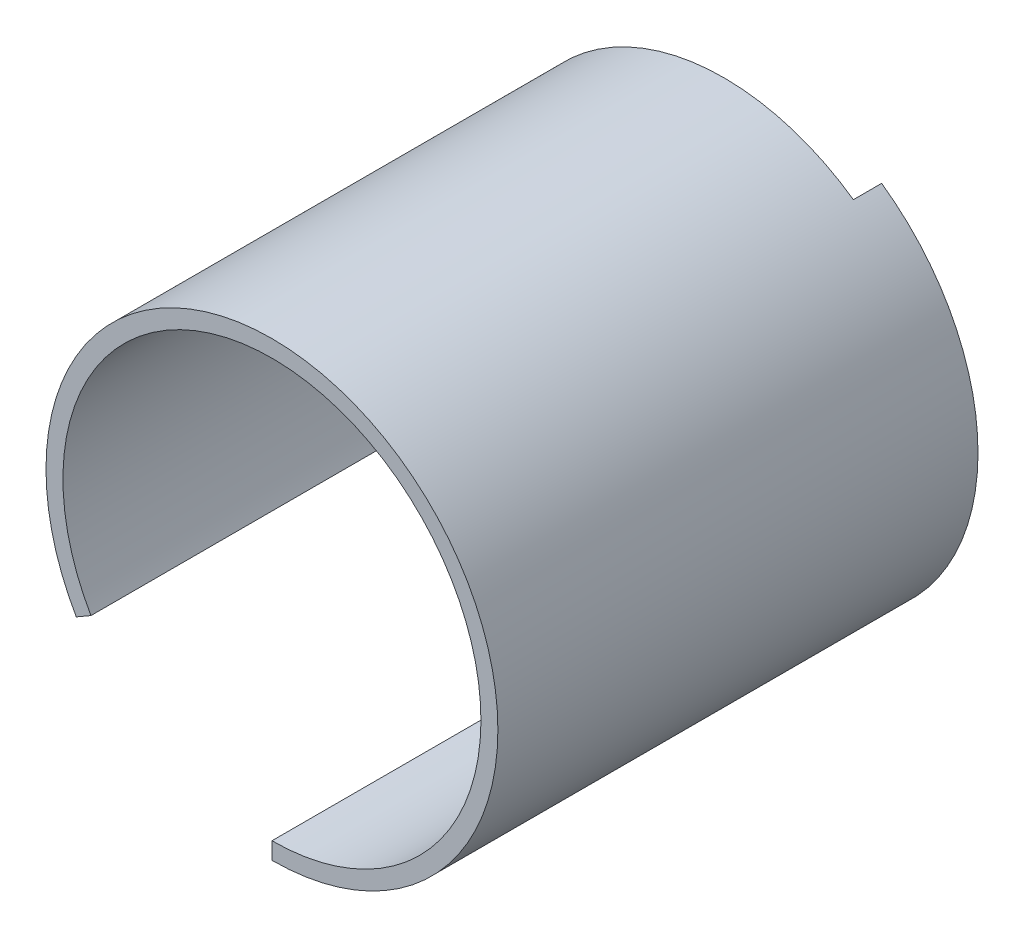
ISO-10303-21;
HEADER;
FILE_DESCRIPTION(('STEP AP214'),'2;1');
FILE_NAME('part.step','',(''),(''),'','','');
FILE_SCHEMA(('AUTOMOTIVE_DESIGN { 1 0 10303 214 1 1 1 1 }'));
ENDSEC;
DATA;
#1=APPLICATION_CONTEXT('core data for automotive mechanical design processes');
#2=APPLICATION_PROTOCOL_DEFINITION('international standard','automotive_design',2000,#1);
#3=PRODUCT_CONTEXT('',#1,'mechanical');
#4=PRODUCT('Part','Part','',(#3));
#5=PRODUCT_RELATED_PRODUCT_CATEGORY('part','',(#4));
#6=PRODUCT_DEFINITION_FORMATION('','',#4);
#7=PRODUCT_DEFINITION_CONTEXT('part definition',#1,'design');
#8=PRODUCT_DEFINITION('design','',#6,#7);
#9=PRODUCT_DEFINITION_SHAPE('','',#8);
#10=(LENGTH_UNIT() NAMED_UNIT(*) SI_UNIT(.MILLI.,.METRE.));
#11=(NAMED_UNIT(*) PLANE_ANGLE_UNIT() SI_UNIT($,.RADIAN.));
#12=(NAMED_UNIT(*) SI_UNIT($,.STERADIAN.) SOLID_ANGLE_UNIT());
#13=UNCERTAINTY_MEASURE_WITH_UNIT(LENGTH_MEASURE(1.E-05),#10,'distance_accuracy_value','');
#14=(GEOMETRIC_REPRESENTATION_CONTEXT(3) GLOBAL_UNCERTAINTY_ASSIGNED_CONTEXT((#13)) GLOBAL_UNIT_ASSIGNED_CONTEXT((#10,
#11,#12)) REPRESENTATION_CONTEXT('',''));
#15=CARTESIAN_POINT('',(0.,0.,0.));
#16=DIRECTION('',(0.,0.,1.));
#17=DIRECTION('',(1.,0.,0.));
#18=AXIS2_PLACEMENT_3D('',#15,#16,#17);
#19=CARTESIAN_POINT('',(0.,0.,80.));
#20=DIRECTION('',(0.,0.,-1.));
#21=DIRECTION('',(-1.,0.,0.));
#22=AXIS2_PLACEMENT_3D('',#19,#20,#21);
#23=CYLINDRICAL_SURFACE('',#22,37.);
#24=CARTESIAN_POINT('',(0.,0.,0.));
#25=DIRECTION('',(0.,0.,-1.));
#26=DIRECTION('',(-1.,0.,0.));
#27=AXIS2_PLACEMENT_3D('',#24,#25,#26);
#28=CIRCLE('',#27,37.);
#29=CARTESIAN_POINT('',(-32.0429399400243,-18.4999999999999,0.));
#30=VERTEX_POINT('',#29);
#31=CARTESIAN_POINT('',(21.2223281449887,30.3086256386927,0.));
#32=VERTEX_POINT('',#31);
#33=EDGE_CURVE('E149',#30,#32,#28,.T.);
#34=ORIENTED_EDGE('',*,*,#33,.T.);
#35=CARTESIAN_POINT('',(0.,-37.,0.));
#36=VERTEX_POINT('',#35);
#37=EDGE_CURVE('E142',#32,#36,#28,.T.);
#38=ORIENTED_EDGE('',*,*,#37,.T.);
#39=DIRECTION('',(0.,0.,-1.));
#40=VECTOR('',#39,1.);
#41=CARTESIAN_POINT('',(0.,-37.,80.));
#42=LINE('',#41,#40);
#43=CARTESIAN_POINT('',(0.,-37.,80.));
#44=VERTEX_POINT('',#43);
#45=EDGE_CURVE('E36',#44,#36,#42,.T.);
#46=ORIENTED_EDGE('',*,*,#45,.F.);
#47=CARTESIAN_POINT('',(0.,0.,80.));
#48=DIRECTION('',(0.,0.,-1.));
#49=DIRECTION('',(-1.,0.,0.));
#50=AXIS2_PLACEMENT_3D('',#47,#48,#49);
#51=CIRCLE('',#50,37.);
#52=CARTESIAN_POINT('',(-32.0429399400243,-18.4999999999999,80.));
#53=VERTEX_POINT('',#52);
#54=EDGE_CURVE('E143',#53,#44,#51,.T.);
#55=ORIENTED_EDGE('',*,*,#54,.F.);
#56=DIRECTION('',(0.,0.,-1.));
#57=VECTOR('',#56,1.);
#58=CARTESIAN_POINT('',(-32.0429399400243,-18.4999999999999,80.));
#59=LINE('',#58,#57);
#60=EDGE_CURVE('E148',#53,#30,#59,.T.);
#61=ORIENTED_EDGE('',*,*,#60,.T.);
#62=EDGE_LOOP('',(#34,#38,#46,#55,#61));
#63=FACE_BOUND('',#62,.T.);
#64=ADVANCED_FACE('F33',(#63),#23,.F.);
#65=CARTESIAN_POINT('',(0.,-37.,80.));
#66=DIRECTION('',(1.,0.,0.));
#67=DIRECTION('',(0.,0.,-1.));
#68=AXIS2_PLACEMENT_3D('',#65,#66,#67);
#69=PLANE('',#68);
#70=ORIENTED_EDGE('',*,*,#45,.T.);
#71=DIRECTION('',(0.,1.,0.));
#72=VECTOR('',#71,1.);
#73=CARTESIAN_POINT('',(0.,-30.,0.));
#74=LINE('',#73,#72);
#75=CARTESIAN_POINT('',(0.,-30.,0.));
#76=VERTEX_POINT('',#75);
#77=EDGE_CURVE('E134',#36,#76,#74,.T.);
#78=ORIENTED_EDGE('',*,*,#77,.T.);
#79=DIRECTION('',(0.,0.,1.));
#80=VECTOR('',#79,1.);
#81=CARTESIAN_POINT('',(0.,-30.,-5.));
#82=LINE('',#81,#80);
#83=CARTESIAN_POINT('',(0.,-30.,-5.));
#84=VERTEX_POINT('',#83);
#85=EDGE_CURVE('E118',#84,#76,#82,.T.);
#86=ORIENTED_EDGE('',*,*,#85,.F.);
#87=DIRECTION('',(0.,1.,0.));
#88=VECTOR('',#87,1.);
#89=CARTESIAN_POINT('',(0.,-30.,-5.));
#90=LINE('',#89,#88);
#91=CARTESIAN_POINT('',(0.,-40.,-5.));
#92=VERTEX_POINT('',#91);
#93=EDGE_CURVE('E115',#92,#84,#90,.T.);
#94=ORIENTED_EDGE('',*,*,#93,.F.);
#95=DIRECTION('',(0.,0.,-1.));
#96=VECTOR('',#95,1.);
#97=CARTESIAN_POINT('',(0.,-40.,80.));
#98=LINE('',#97,#96);
#99=CARTESIAN_POINT('',(0.,-40.,80.));
#100=VERTEX_POINT('',#99);
#101=EDGE_CURVE('E105',#100,#92,#98,.T.);
#102=ORIENTED_EDGE('',*,*,#101,.F.);
#103=DIRECTION('',(0.,-1.,0.));
#104=VECTOR('',#103,1.);
#105=CARTESIAN_POINT('',(0.,-37.,80.));
#106=LINE('',#105,#104);
#107=EDGE_CURVE('E82',#44,#100,#106,.T.);
#108=ORIENTED_EDGE('',*,*,#107,.F.);
#109=EDGE_LOOP('',(#70,#78,#86,#94,#102,#108));
#110=FACE_BOUND('',#109,.T.);
#111=ADVANCED_FACE('F116',(#110),#69,.F.);
#112=CARTESIAN_POINT('',(0.,0.,80.));
#113=DIRECTION('',(0.,0.,-1.));
#114=DIRECTION('',(-1.,0.,0.));
#115=AXIS2_PLACEMENT_3D('',#112,#113,#114);
#116=CYLINDRICAL_SURFACE('',#115,40.);
#117=ORIENTED_EDGE('',*,*,#101,.T.);
#118=CARTESIAN_POINT('',(0.,0.,-5.));
#119=DIRECTION('',(0.,0.,-1.));
#120=DIRECTION('',(-1.,0.,0.));
#121=AXIS2_PLACEMENT_3D('',#118,#119,#120);
#122=CIRCLE('',#121,40.);
#123=CARTESIAN_POINT('',(22.9430574540419,32.7660817715596,-5.));
#124=VERTEX_POINT('',#123);
#125=EDGE_CURVE('E110',#124,#92,#122,.T.);
#126=ORIENTED_EDGE('',*,*,#125,.F.);
#127=DIRECTION('',(0.,0.,1.));
#128=VECTOR('',#127,1.);
#129=CARTESIAN_POINT('',(22.9430574540419,32.7660817715596,-5.));
#130=LINE('',#129,#128);
#131=CARTESIAN_POINT('',(22.9430574540419,32.7660817715596,0.));
#132=VERTEX_POINT('',#131);
#133=EDGE_CURVE('E133',#124,#132,#130,.T.);
#134=ORIENTED_EDGE('',*,*,#133,.T.);
#135=CARTESIAN_POINT('',(0.,0.,0.));
#136=DIRECTION('',(0.,0.,1.));
#137=DIRECTION('',(-1.,0.,0.));
#138=AXIS2_PLACEMENT_3D('',#135,#136,#137);
#139=CIRCLE('',#138,40.);
#140=CARTESIAN_POINT('',(-34.6410161513776,-19.9999999999999,0.));
#141=VERTEX_POINT('',#140);
#142=EDGE_CURVE('E151',#132,#141,#139,.T.);
#143=ORIENTED_EDGE('',*,*,#142,.T.);
#144=DIRECTION('',(0.,0.,-1.));
#145=VECTOR('',#144,1.);
#146=CARTESIAN_POINT('',(-34.6410161513776,-19.9999999999999,80.));
#147=LINE('',#146,#145);
#148=CARTESIAN_POINT('',(-34.6410161513776,-19.9999999999999,80.));
#149=VERTEX_POINT('',#148);
#150=EDGE_CURVE('E113',#149,#141,#147,.T.);
#151=ORIENTED_EDGE('',*,*,#150,.F.);
#152=CARTESIAN_POINT('',(0.,0.,80.));
#153=DIRECTION('',(0.,0.,1.));
#154=DIRECTION('',(-1.,0.,0.));
#155=AXIS2_PLACEMENT_3D('',#152,#153,#154);
#156=CIRCLE('',#155,40.);
#157=EDGE_CURVE('E112',#100,#149,#156,.T.);
#158=ORIENTED_EDGE('',*,*,#157,.F.);
#159=EDGE_LOOP('',(#117,#126,#134,#143,#151,#158));
#160=FACE_BOUND('',#159,.T.);
#161=ADVANCED_FACE('F107',(#160),#116,.T.);
#162=CARTESIAN_POINT('',(-34.6410161513776,-19.9999999999999,80.));
#163=DIRECTION('',(-0.499999999999999,0.866025403784439,0.));
#164=DIRECTION('',(-0.866025403784439,-0.499999999999999,0.));
#165=AXIS2_PLACEMENT_3D('',#162,#163,#164);
#166=PLANE('',#165);
#167=DIRECTION('',(0.866025403784439,0.499999999999999,0.));
#168=VECTOR('',#167,1.);
#169=CARTESIAN_POINT('',(-34.6410161513776,-19.9999999999999,0.));
#170=LINE('',#169,#168);
#171=EDGE_CURVE('E74',#141,#30,#170,.T.);
#172=ORIENTED_EDGE('',*,*,#171,.T.);
#173=ORIENTED_EDGE('',*,*,#60,.F.);
#174=DIRECTION('',(0.866025403784439,0.499999999999999,0.));
#175=VECTOR('',#174,1.);
#176=CARTESIAN_POINT('',(-34.6410161513776,-19.9999999999999,80.));
#177=LINE('',#176,#175);
#178=EDGE_CURVE('E56',#149,#53,#177,.T.);
#179=ORIENTED_EDGE('',*,*,#178,.F.);
#180=ORIENTED_EDGE('',*,*,#150,.T.);
#181=EDGE_LOOP('',(#172,#173,#179,#180));
#182=FACE_BOUND('',#181,.T.);
#183=ADVANCED_FACE('F155',(#182),#166,.F.);
#184=CARTESIAN_POINT('',(0.,0.,80.));
#185=DIRECTION('',(0.,0.,-1.));
#186=DIRECTION('',(-1.,0.,0.));
#187=AXIS2_PLACEMENT_3D('',#184,#185,#186);
#188=PLANE('',#187);
#189=ORIENTED_EDGE('',*,*,#54,.T.);
#190=ORIENTED_EDGE('',*,*,#107,.T.);
#191=ORIENTED_EDGE('',*,*,#157,.T.);
#192=ORIENTED_EDGE('',*,*,#178,.T.);
#193=EDGE_LOOP('',(#189,#190,#191,#192));
#194=FACE_BOUND('',#193,.T.);
#195=ADVANCED_FACE('F178',(#194),#188,.F.);
#196=CARTESIAN_POINT('',(0.,0.,0.));
#197=DIRECTION('',(0.,0.,-1.));
#198=DIRECTION('',(-1.,0.,0.));
#199=AXIS2_PLACEMENT_3D('',#196,#197,#198);
#200=PLANE('',#199);
#201=DIRECTION('',(0.573576436351047,0.819152044288991,0.));
#202=VECTOR('',#201,1.);
#203=CARTESIAN_POINT('',(22.9430574540419,32.7660817715596,0.));
#204=LINE('',#203,#202);
#205=EDGE_CURVE('E11',#32,#132,#204,.T.);
#206=ORIENTED_EDGE('',*,*,#205,.F.);
#207=ORIENTED_EDGE('',*,*,#33,.F.);
#208=ORIENTED_EDGE('',*,*,#171,.F.);
#209=ORIENTED_EDGE('',*,*,#142,.F.);
#210=EDGE_LOOP('',(#206,#207,#208,#209));
#211=FACE_BOUND('',#210,.T.);
#212=ADVANCED_FACE('F156',(#211),#200,.T.);
#213=CARTESIAN_POINT('',(0.,0.,-5.));
#214=DIRECTION('',(0.,0.,1.));
#215=DIRECTION('',(1.,0.,0.));
#216=AXIS2_PLACEMENT_3D('',#213,#214,#215);
#217=CYLINDRICAL_SURFACE('',#216,30.);
#218=CARTESIAN_POINT('',(0.,0.,0.));
#219=DIRECTION('',(0.,0.,1.));
#220=DIRECTION('',(-1.,0.,0.));
#221=AXIS2_PLACEMENT_3D('',#218,#219,#220);
#222=CIRCLE('',#221,30.);
#223=CARTESIAN_POINT('',(17.2072930905314,24.5745613286697,0.));
#224=VERTEX_POINT('',#223);
#225=EDGE_CURVE('E129',#76,#224,#222,.T.);
#226=ORIENTED_EDGE('',*,*,#225,.T.);
#227=DIRECTION('',(0.,0.,1.));
#228=VECTOR('',#227,1.);
#229=CARTESIAN_POINT('',(17.2072930905314,24.5745613286697,-5.));
#230=LINE('',#229,#228);
#231=CARTESIAN_POINT('',(17.2072930905314,24.5745613286697,-5.));
#232=VERTEX_POINT('',#231);
#233=EDGE_CURVE('E138',#232,#224,#230,.T.);
#234=ORIENTED_EDGE('',*,*,#233,.F.);
#235=CARTESIAN_POINT('',(0.,0.,-5.));
#236=DIRECTION('',(0.,0.,1.));
#237=DIRECTION('',(-1.,0.,0.));
#238=AXIS2_PLACEMENT_3D('',#235,#236,#237);
#239=CIRCLE('',#238,30.);
#240=EDGE_CURVE('E121',#84,#232,#239,.T.);
#241=ORIENTED_EDGE('',*,*,#240,.F.);
#242=ORIENTED_EDGE('',*,*,#85,.T.);
#243=EDGE_LOOP('',(#226,#234,#241,#242));
#244=FACE_BOUND('',#243,.T.);
#245=ADVANCED_FACE('F170',(#244),#217,.F.);
#246=CARTESIAN_POINT('',(22.9430574540419,32.7660817715596,-5.));
#247=DIRECTION('',(0.819152044288991,-0.573576436351047,0.));
#248=DIRECTION('',(0.573576436351047,0.819152044288991,0.));
#249=AXIS2_PLACEMENT_3D('',#246,#247,#248);
#250=PLANE('',#249);
#251=EDGE_CURVE('E42',#224,#32,#204,.T.);
#252=ORIENTED_EDGE('',*,*,#251,.T.);
#253=ORIENTED_EDGE('',*,*,#205,.T.);
#254=ORIENTED_EDGE('',*,*,#133,.F.);
#255=DIRECTION('',(0.573576436351047,0.819152044288991,0.));
#256=VECTOR('',#255,1.);
#257=CARTESIAN_POINT('',(22.9430574540419,32.7660817715596,-5.));
#258=LINE('',#257,#256);
#259=EDGE_CURVE('E125',#232,#124,#258,.T.);
#260=ORIENTED_EDGE('',*,*,#259,.F.);
#261=ORIENTED_EDGE('',*,*,#233,.T.);
#262=EDGE_LOOP('',(#252,#253,#254,#260,#261));
#263=FACE_BOUND('',#262,.T.);
#264=ADVANCED_FACE('F167',(#263),#250,.F.);
#265=CARTESIAN_POINT('',(0.,0.,-5.));
#266=DIRECTION('',(0.,0.,-1.));
#267=DIRECTION('',(-1.,0.,0.));
#268=AXIS2_PLACEMENT_3D('',#265,#266,#267);
#269=PLANE('',#268);
#270=ORIENTED_EDGE('',*,*,#125,.T.);
#271=ORIENTED_EDGE('',*,*,#93,.T.);
#272=ORIENTED_EDGE('',*,*,#240,.T.);
#273=ORIENTED_EDGE('',*,*,#259,.T.);
#274=EDGE_LOOP('',(#270,#271,#272,#273));
#275=FACE_BOUND('',#274,.T.);
#276=ADVANCED_FACE('F123',(#275),#269,.T.);
#277=CARTESIAN_POINT('',(0.,0.,0.));
#278=DIRECTION('',(0.,0.,-1.));
#279=DIRECTION('',(-1.,0.,0.));
#280=AXIS2_PLACEMENT_3D('',#277,#278,#279);
#281=PLANE('',#280);
#282=ORIENTED_EDGE('',*,*,#37,.F.);
#283=ORIENTED_EDGE('',*,*,#251,.F.);
#284=ORIENTED_EDGE('',*,*,#225,.F.);
#285=ORIENTED_EDGE('',*,*,#77,.F.);
#286=EDGE_LOOP('',(#282,#283,#284,#285));
#287=FACE_BOUND('',#286,.T.);
#288=ADVANCED_FACE('F164',(#287),#281,.F.);
#289=CLOSED_SHELL('',(#64,#111,#161,#183,#195,#212,#245,#264,#276,#288));
#290=MANIFOLD_SOLID_BREP('B2',#289);
#291=ADVANCED_BREP_SHAPE_REPRESENTATION('',(#18,#290),#14);
#292=SHAPE_DEFINITION_REPRESENTATION(#9,#291);
ENDSEC;
END-ISO-10303-21;
